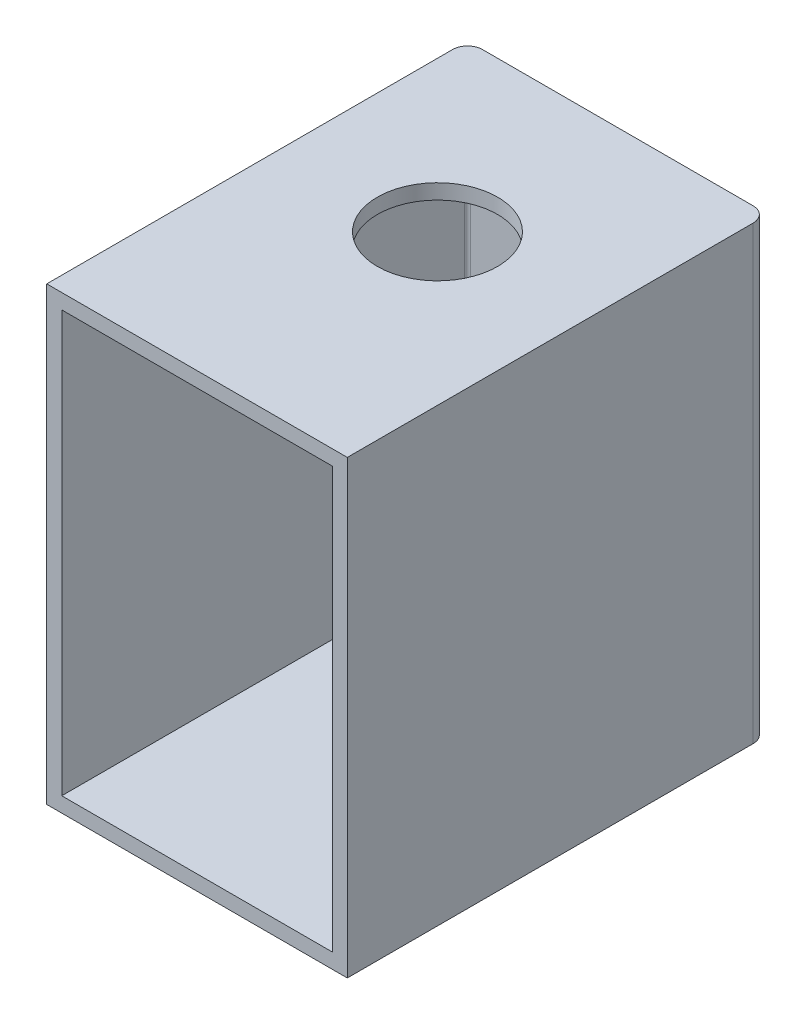
ISO-10303-21;
HEADER;
FILE_DESCRIPTION(('STEP AP214'),'2;1');
FILE_NAME('part.step','',(''),(''),'','','');
FILE_SCHEMA(('AUTOMOTIVE_DESIGN { 1 0 10303 214 1 1 1 1 }'));
ENDSEC;
DATA;
#1=APPLICATION_CONTEXT('core data for automotive mechanical design processes');
#2=APPLICATION_PROTOCOL_DEFINITION('international standard','automotive_design',2000,#1);
#3=PRODUCT_CONTEXT('',#1,'mechanical');
#4=PRODUCT('Part','Part','',(#3));
#5=PRODUCT_RELATED_PRODUCT_CATEGORY('part','',(#4));
#6=PRODUCT_DEFINITION_FORMATION('','',#4);
#7=PRODUCT_DEFINITION_CONTEXT('part definition',#1,'design');
#8=PRODUCT_DEFINITION('design','',#6,#7);
#9=PRODUCT_DEFINITION_SHAPE('','',#8);
#10=(LENGTH_UNIT() NAMED_UNIT(*) SI_UNIT(.MILLI.,.METRE.));
#11=(NAMED_UNIT(*) PLANE_ANGLE_UNIT() SI_UNIT($,.RADIAN.));
#12=(NAMED_UNIT(*) SI_UNIT($,.STERADIAN.) SOLID_ANGLE_UNIT());
#13=UNCERTAINTY_MEASURE_WITH_UNIT(LENGTH_MEASURE(1.E-05),#10,'distance_accuracy_value','');
#14=(GEOMETRIC_REPRESENTATION_CONTEXT(3) GLOBAL_UNCERTAINTY_ASSIGNED_CONTEXT((#13)) GLOBAL_UNIT_ASSIGNED_CONTEXT((#10,
#11,#12)) REPRESENTATION_CONTEXT('',''));
#15=CARTESIAN_POINT('',(0.,0.,0.));
#16=DIRECTION('',(0.,0.,1.));
#17=DIRECTION('',(1.,0.,0.));
#18=AXIS2_PLACEMENT_3D('',#15,#16,#17);
#19=CARTESIAN_POINT('',(-10.,15.,14.));
#20=DIRECTION('',(0.,0.,-1.));
#21=DIRECTION('',(-1.,0.,0.));
#22=AXIS2_PLACEMENT_3D('',#19,#20,#21);
#23=PLANE('',#22);
#24=DIRECTION('',(1.,0.,0.));
#25=VECTOR('',#24,1.);
#26=CARTESIAN_POINT('',(-10.,-15.,14.));
#27=LINE('',#26,#25);
#28=CARTESIAN_POINT('',(-10.,-15.,14.));
#29=VERTEX_POINT('',#28);
#30=CARTESIAN_POINT('',(10.,-15.,14.));
#31=VERTEX_POINT('',#30);
#32=EDGE_CURVE('E157',#29,#31,#27,.T.);
#33=ORIENTED_EDGE('',*,*,#32,.T.);
#34=DIRECTION('',(0.,-1.,0.));
#35=VECTOR('',#34,1.);
#36=CARTESIAN_POINT('',(10.,15.,14.));
#37=LINE('',#36,#35);
#38=CARTESIAN_POINT('',(10.,15.,14.));
#39=VERTEX_POINT('',#38);
#40=EDGE_CURVE('E164',#39,#31,#37,.T.);
#41=ORIENTED_EDGE('',*,*,#40,.F.);
#42=DIRECTION('',(1.,0.,0.));
#43=VECTOR('',#42,1.);
#44=CARTESIAN_POINT('',(-10.,15.,14.));
#45=LINE('',#44,#43);
#46=CARTESIAN_POINT('',(-10.,15.,14.));
#47=VERTEX_POINT('',#46);
#48=EDGE_CURVE('E162',#47,#39,#45,.T.);
#49=ORIENTED_EDGE('',*,*,#48,.F.);
#50=DIRECTION('',(0.,-1.,0.));
#51=VECTOR('',#50,1.);
#52=CARTESIAN_POINT('',(-10.,15.,14.));
#53=LINE('',#52,#51);
#54=EDGE_CURVE('E175',#47,#29,#53,.T.);
#55=ORIENTED_EDGE('',*,*,#54,.T.);
#56=EDGE_LOOP('',(#33,#41,#49,#55));
#57=FACE_BOUND('',#56,.T.);
#58=DIRECTION('',(1.,0.,0.));
#59=VECTOR('',#58,1.);
#60=CARTESIAN_POINT('',(-10.,-14.,14.));
#61=LINE('',#60,#59);
#62=CARTESIAN_POINT('',(-9.,-14.,14.));
#63=VERTEX_POINT('',#62);
#64=CARTESIAN_POINT('',(9.,-14.,14.));
#65=VERTEX_POINT('',#64);
#66=EDGE_CURVE('E141',#63,#65,#61,.T.);
#67=ORIENTED_EDGE('',*,*,#66,.F.);
#68=DIRECTION('',(0.,-1.,0.));
#69=VECTOR('',#68,1.);
#70=CARTESIAN_POINT('',(-9.,15.,14.));
#71=LINE('',#70,#69);
#72=CARTESIAN_POINT('',(-9.,14.,14.));
#73=VERTEX_POINT('',#72);
#74=EDGE_CURVE('E130',#73,#63,#71,.T.);
#75=ORIENTED_EDGE('',*,*,#74,.F.);
#76=DIRECTION('',(1.,0.,0.));
#77=VECTOR('',#76,1.);
#78=CARTESIAN_POINT('',(-10.,14.,14.));
#79=LINE('',#78,#77);
#80=CARTESIAN_POINT('',(9.,14.,14.));
#81=VERTEX_POINT('',#80);
#82=EDGE_CURVE('E131',#73,#81,#79,.T.);
#83=ORIENTED_EDGE('',*,*,#82,.T.);
#84=DIRECTION('',(0.,-1.,0.));
#85=VECTOR('',#84,1.);
#86=CARTESIAN_POINT('',(9.,15.,14.));
#87=LINE('',#86,#85);
#88=EDGE_CURVE('E122',#81,#65,#87,.T.);
#89=ORIENTED_EDGE('',*,*,#88,.T.);
#90=EDGE_LOOP('',(#67,#75,#83,#89));
#91=FACE_BOUND('',#90,.T.);
#92=ADVANCED_FACE('F32',(#57,#91),#23,.F.);
#93=CARTESIAN_POINT('',(10.,15.,-14.));
#94=DIRECTION('',(-1.,0.,0.));
#95=DIRECTION('',(0.,0.,1.));
#96=AXIS2_PLACEMENT_3D('',#93,#94,#95);
#97=PLANE('',#96);
#98=DIRECTION('',(0.,0.,-1.));
#99=VECTOR('',#98,1.);
#100=CARTESIAN_POINT('',(10.,-15.,-14.));
#101=LINE('',#100,#99);
#102=CARTESIAN_POINT('',(10.,-15.,-13.));
#103=VERTEX_POINT('',#102);
#104=EDGE_CURVE('E150',#31,#103,#101,.T.);
#105=ORIENTED_EDGE('',*,*,#104,.T.);
#106=DIRECTION('',(0.,-1.,0.));
#107=VECTOR('',#106,1.);
#108=CARTESIAN_POINT('',(10.,15.,-13.));
#109=LINE('',#108,#107);
#110=CARTESIAN_POINT('',(10.,15.,-13.));
#111=VERTEX_POINT('',#110);
#112=EDGE_CURVE('E194',#103,#111,#109,.F.);
#113=ORIENTED_EDGE('',*,*,#112,.T.);
#114=DIRECTION('',(0.,0.,-1.));
#115=VECTOR('',#114,1.);
#116=CARTESIAN_POINT('',(10.,15.,-14.));
#117=LINE('',#116,#115);
#118=EDGE_CURVE('E153',#39,#111,#117,.T.);
#119=ORIENTED_EDGE('',*,*,#118,.F.);
#120=ORIENTED_EDGE('',*,*,#40,.T.);
#121=EDGE_LOOP('',(#105,#113,#119,#120));
#122=FACE_BOUND('',#121,.T.);
#123=ADVANCED_FACE('F229',(#122),#97,.F.);
#124=CARTESIAN_POINT('',(-10.,15.,-14.));
#125=DIRECTION('',(0.,0.,1.));
#126=DIRECTION('',(1.,0.,0.));
#127=AXIS2_PLACEMENT_3D('',#124,#125,#126);
#128=PLANE('',#127);
#129=DIRECTION('',(-1.,0.,0.));
#130=VECTOR('',#129,1.);
#131=CARTESIAN_POINT('',(-10.,-15.,-14.));
#132=LINE('',#131,#130);
#133=CARTESIAN_POINT('',(9.,-15.,-14.));
#134=VERTEX_POINT('',#133);
#135=CARTESIAN_POINT('',(-9.,-15.,-14.));
#136=VERTEX_POINT('',#135);
#137=EDGE_CURVE('E167',#134,#136,#132,.T.);
#138=ORIENTED_EDGE('',*,*,#137,.T.);
#139=DIRECTION('',(0.,-1.,0.));
#140=VECTOR('',#139,1.);
#141=CARTESIAN_POINT('',(-9.,15.,-14.));
#142=LINE('',#141,#140);
#143=CARTESIAN_POINT('',(-9.,15.,-14.));
#144=VERTEX_POINT('',#143);
#145=EDGE_CURVE('E188',#136,#144,#142,.F.);
#146=ORIENTED_EDGE('',*,*,#145,.T.);
#147=DIRECTION('',(-1.,0.,0.));
#148=VECTOR('',#147,1.);
#149=CARTESIAN_POINT('',(-10.,15.,-14.));
#150=LINE('',#149,#148);
#151=CARTESIAN_POINT('',(9.,15.,-14.));
#152=VERTEX_POINT('',#151);
#153=EDGE_CURVE('E156',#152,#144,#150,.T.);
#154=ORIENTED_EDGE('',*,*,#153,.F.);
#155=DIRECTION('',(0.,-1.,0.));
#156=VECTOR('',#155,1.);
#157=CARTESIAN_POINT('',(9.,15.,-14.));
#158=LINE('',#157,#156);
#159=EDGE_CURVE('E185',#152,#134,#158,.T.);
#160=ORIENTED_EDGE('',*,*,#159,.T.);
#161=EDGE_LOOP('',(#138,#146,#154,#160));
#162=FACE_BOUND('',#161,.T.);
#163=ADVANCED_FACE('F235',(#162),#128,.F.);
#164=CARTESIAN_POINT('',(-10.,15.,-14.));
#165=DIRECTION('',(1.,0.,0.));
#166=DIRECTION('',(0.,0.,-1.));
#167=AXIS2_PLACEMENT_3D('',#164,#165,#166);
#168=PLANE('',#167);
#169=DIRECTION('',(0.,0.,1.));
#170=VECTOR('',#169,1.);
#171=CARTESIAN_POINT('',(-10.,15.,-14.));
#172=LINE('',#171,#170);
#173=CARTESIAN_POINT('',(-10.,15.,-13.));
#174=VERTEX_POINT('',#173);
#175=EDGE_CURVE('E160',#174,#47,#172,.T.);
#176=ORIENTED_EDGE('',*,*,#175,.F.);
#177=DIRECTION('',(0.,-1.,0.));
#178=VECTOR('',#177,1.);
#179=CARTESIAN_POINT('',(-10.,15.,-13.));
#180=LINE('',#179,#178);
#181=CARTESIAN_POINT('',(-10.,-15.,-13.));
#182=VERTEX_POINT('',#181);
#183=EDGE_CURVE('E178',#174,#182,#180,.T.);
#184=ORIENTED_EDGE('',*,*,#183,.T.);
#185=DIRECTION('',(0.,0.,1.));
#186=VECTOR('',#185,1.);
#187=CARTESIAN_POINT('',(-10.,-15.,-14.));
#188=LINE('',#187,#186);
#189=EDGE_CURVE('E170',#182,#29,#188,.T.);
#190=ORIENTED_EDGE('',*,*,#189,.T.);
#191=ORIENTED_EDGE('',*,*,#54,.F.);
#192=EDGE_LOOP('',(#176,#184,#190,#191));
#193=FACE_BOUND('',#192,.T.);
#194=ADVANCED_FACE('F242',(#193),#168,.F.);
#195=CARTESIAN_POINT('',(0.,15.,0.));
#196=DIRECTION('',(0.,1.,0.));
#197=DIRECTION('',(0.,0.,1.));
#198=AXIS2_PLACEMENT_3D('',#195,#196,#197);
#199=PLANE('',#198);
#200=CARTESIAN_POINT('',(0.,15.,-2.));
#201=DIRECTION('',(0.,1.,0.));
#202=DIRECTION('',(0.,0.,1.));
#203=AXIS2_PLACEMENT_3D('',#200,#201,#202);
#204=CIRCLE('',#203,4.);
#205=CARTESIAN_POINT('',(0.,15.,2.));
#206=VERTEX_POINT('',#205);
#207=EDGE_CURVE('E287',#206,#206,#204,.T.);
#208=ORIENTED_EDGE('',*,*,#207,.F.);
#209=EDGE_LOOP('',(#208));
#210=FACE_BOUND('',#209,.T.);
#211=ORIENTED_EDGE('',*,*,#153,.T.);
#212=CARTESIAN_POINT('',(-9.,15.,-13.));
#213=DIRECTION('',(0.,1.,0.));
#214=DIRECTION('',(0.,0.,1.));
#215=AXIS2_PLACEMENT_3D('',#212,#213,#214);
#216=CIRCLE('',#215,1.);
#217=EDGE_CURVE('E192',#144,#174,#216,.T.);
#218=ORIENTED_EDGE('',*,*,#217,.T.);
#219=ORIENTED_EDGE('',*,*,#175,.T.);
#220=ORIENTED_EDGE('',*,*,#48,.T.);
#221=ORIENTED_EDGE('',*,*,#118,.T.);
#222=CARTESIAN_POINT('',(9.,15.,-13.));
#223=DIRECTION('',(0.,1.,0.));
#224=DIRECTION('',(0.,0.,1.));
#225=AXIS2_PLACEMENT_3D('',#222,#223,#224);
#226=CIRCLE('',#225,1.);
#227=EDGE_CURVE('E190',#111,#152,#226,.T.);
#228=ORIENTED_EDGE('',*,*,#227,.T.);
#229=EDGE_LOOP('',(#211,#218,#219,#220,#221,#228));
#230=FACE_BOUND('',#229,.T.);
#231=ADVANCED_FACE('F245',(#210,#230),#199,.T.);
#232=CARTESIAN_POINT('',(0.,-15.,0.));
#233=DIRECTION('',(0.,1.,0.));
#234=DIRECTION('',(0.,0.,1.));
#235=AXIS2_PLACEMENT_3D('',#232,#233,#234);
#236=PLANE('',#235);
#237=CARTESIAN_POINT('',(0.,-15.,-2.));
#238=DIRECTION('',(0.,1.,0.));
#239=DIRECTION('',(0.,0.,1.));
#240=AXIS2_PLACEMENT_3D('',#237,#238,#239);
#241=CIRCLE('',#240,4.5);
#242=CARTESIAN_POINT('',(0.,-15.,2.5));
#243=VERTEX_POINT('',#242);
#244=EDGE_CURVE('E286',#243,#243,#241,.T.);
#245=ORIENTED_EDGE('',*,*,#244,.T.);
#246=EDGE_LOOP('',(#245));
#247=FACE_BOUND('',#246,.T.);
#248=ORIENTED_EDGE('',*,*,#189,.F.);
#249=CARTESIAN_POINT('',(-9.,-15.,-13.));
#250=DIRECTION('',(0.,1.,0.));
#251=DIRECTION('',(0.,0.,1.));
#252=AXIS2_PLACEMENT_3D('',#249,#250,#251);
#253=CIRCLE('',#252,1.);
#254=EDGE_CURVE('E183',#182,#136,#253,.F.);
#255=ORIENTED_EDGE('',*,*,#254,.T.);
#256=ORIENTED_EDGE('',*,*,#137,.F.);
#257=CARTESIAN_POINT('',(9.,-15.,-13.));
#258=DIRECTION('',(0.,1.,0.));
#259=DIRECTION('',(0.,0.,1.));
#260=AXIS2_PLACEMENT_3D('',#257,#258,#259);
#261=CIRCLE('',#260,1.);
#262=EDGE_CURVE('E181',#134,#103,#261,.F.);
#263=ORIENTED_EDGE('',*,*,#262,.T.);
#264=ORIENTED_EDGE('',*,*,#104,.F.);
#265=ORIENTED_EDGE('',*,*,#32,.F.);
#266=EDGE_LOOP('',(#248,#255,#256,#263,#264,#265));
#267=FACE_BOUND('',#266,.T.);
#268=ADVANCED_FACE('F240',(#247,#267),#236,.F.);
#269=CARTESIAN_POINT('',(-9.,15.,-13.));
#270=DIRECTION('',(0.,-1.,0.));
#271=DIRECTION('',(0.,0.,-1.));
#272=AXIS2_PLACEMENT_3D('',#269,#270,#271);
#273=CYLINDRICAL_SURFACE('',#272,1.);
#274=ORIENTED_EDGE('',*,*,#217,.F.);
#275=ORIENTED_EDGE('',*,*,#145,.F.);
#276=ORIENTED_EDGE('',*,*,#254,.F.);
#277=ORIENTED_EDGE('',*,*,#183,.F.);
#278=EDGE_LOOP('',(#274,#275,#276,#277));
#279=FACE_BOUND('',#278,.T.);
#280=ADVANCED_FACE('F250',(#279),#273,.T.);
#281=CARTESIAN_POINT('',(9.,15.,-13.));
#282=DIRECTION('',(0.,-1.,0.));
#283=DIRECTION('',(0.,0.,-1.));
#284=AXIS2_PLACEMENT_3D('',#281,#282,#283);
#285=CYLINDRICAL_SURFACE('',#284,1.);
#286=ORIENTED_EDGE('',*,*,#227,.F.);
#287=ORIENTED_EDGE('',*,*,#112,.F.);
#288=ORIENTED_EDGE('',*,*,#262,.F.);
#289=ORIENTED_EDGE('',*,*,#159,.F.);
#290=EDGE_LOOP('',(#286,#287,#288,#289));
#291=FACE_BOUND('',#290,.T.);
#292=ADVANCED_FACE('F252',(#291),#285,.T.);
#293=CARTESIAN_POINT('',(9.,15.,-14.));
#294=DIRECTION('',(-1.,0.,0.));
#295=DIRECTION('',(0.,0.,1.));
#296=AXIS2_PLACEMENT_3D('',#293,#294,#295);
#297=PLANE('',#296);
#298=DIRECTION('',(0.,0.,-1.));
#299=VECTOR('',#298,1.);
#300=CARTESIAN_POINT('',(9.,14.,-14.));
#301=LINE('',#300,#299);
#302=CARTESIAN_POINT('',(9.,14.,-12.8));
#303=VERTEX_POINT('',#302);
#304=EDGE_CURVE('E125',#81,#303,#301,.T.);
#305=ORIENTED_EDGE('',*,*,#304,.T.);
#306=DIRECTION('',(0.,1.,0.));
#307=VECTOR('',#306,1.);
#308=CARTESIAN_POINT('',(9.,-14.,-12.8));
#309=LINE('',#308,#307);
#310=CARTESIAN_POINT('',(9.,-14.,-12.8));
#311=VERTEX_POINT('',#310);
#312=EDGE_CURVE('E55',#303,#311,#309,.F.);
#313=ORIENTED_EDGE('',*,*,#312,.T.);
#314=DIRECTION('',(0.,0.,-1.));
#315=VECTOR('',#314,1.);
#316=CARTESIAN_POINT('',(9.,-14.,-14.));
#317=LINE('',#316,#315);
#318=EDGE_CURVE('E126',#65,#311,#317,.T.);
#319=ORIENTED_EDGE('',*,*,#318,.F.);
#320=ORIENTED_EDGE('',*,*,#88,.F.);
#321=EDGE_LOOP('',(#305,#313,#319,#320));
#322=FACE_BOUND('',#321,.T.);
#323=ADVANCED_FACE('F124',(#322),#297,.T.);
#324=CARTESIAN_POINT('',(-10.,15.,-13.));
#325=DIRECTION('',(0.,0.,1.));
#326=DIRECTION('',(1.,0.,0.));
#327=AXIS2_PLACEMENT_3D('',#324,#325,#326);
#328=PLANE('',#327);
#329=DIRECTION('',(-1.,0.,0.));
#330=VECTOR('',#329,1.);
#331=CARTESIAN_POINT('',(-10.,-14.,-13.));
#332=LINE('',#331,#330);
#333=CARTESIAN_POINT('',(8.8,-14.,-13.));
#334=VERTEX_POINT('',#333);
#335=CARTESIAN_POINT('',(-8.8,-14.,-13.));
#336=VERTEX_POINT('',#335);
#337=EDGE_CURVE('E208',#334,#336,#332,.T.);
#338=ORIENTED_EDGE('',*,*,#337,.F.);
#339=DIRECTION('',(0.,1.,0.));
#340=VECTOR('',#339,1.);
#341=CARTESIAN_POINT('',(8.8,14.,-13.));
#342=LINE('',#341,#340);
#343=CARTESIAN_POINT('',(8.8,14.,-13.));
#344=VERTEX_POINT('',#343);
#345=EDGE_CURVE('E198',#334,#344,#342,.T.);
#346=ORIENTED_EDGE('',*,*,#345,.T.);
#347=DIRECTION('',(-1.,0.,0.));
#348=VECTOR('',#347,1.);
#349=CARTESIAN_POINT('',(-10.,14.,-13.));
#350=LINE('',#349,#348);
#351=CARTESIAN_POINT('',(-8.8,14.,-13.));
#352=VERTEX_POINT('',#351);
#353=EDGE_CURVE('E140',#344,#352,#350,.T.);
#354=ORIENTED_EDGE('',*,*,#353,.T.);
#355=DIRECTION('',(0.,1.,0.));
#356=VECTOR('',#355,1.);
#357=CARTESIAN_POINT('',(-8.8,-14.,-13.));
#358=LINE('',#357,#356);
#359=EDGE_CURVE('E196',#352,#336,#358,.F.);
#360=ORIENTED_EDGE('',*,*,#359,.T.);
#361=EDGE_LOOP('',(#338,#346,#354,#360));
#362=FACE_BOUND('',#361,.T.);
#363=ADVANCED_FACE('F212',(#362),#328,.T.);
#364=CARTESIAN_POINT('',(-9.,15.,-14.));
#365=DIRECTION('',(1.,0.,0.));
#366=DIRECTION('',(0.,0.,-1.));
#367=AXIS2_PLACEMENT_3D('',#364,#365,#366);
#368=PLANE('',#367);
#369=DIRECTION('',(0.,0.,1.));
#370=VECTOR('',#369,1.);
#371=CARTESIAN_POINT('',(-9.,-14.,-14.));
#372=LINE('',#371,#370);
#373=CARTESIAN_POINT('',(-9.,-14.,-12.8));
#374=VERTEX_POINT('',#373);
#375=EDGE_CURVE('E152',#374,#63,#372,.T.);
#376=ORIENTED_EDGE('',*,*,#375,.F.);
#377=DIRECTION('',(0.,1.,0.));
#378=VECTOR('',#377,1.);
#379=CARTESIAN_POINT('',(-9.,14.,-12.8));
#380=LINE('',#379,#378);
#381=CARTESIAN_POINT('',(-9.,14.,-12.8));
#382=VERTEX_POINT('',#381);
#383=EDGE_CURVE('E11',#374,#382,#380,.T.);
#384=ORIENTED_EDGE('',*,*,#383,.T.);
#385=DIRECTION('',(0.,0.,1.));
#386=VECTOR('',#385,1.);
#387=CARTESIAN_POINT('',(-9.,14.,-14.));
#388=LINE('',#387,#386);
#389=EDGE_CURVE('E144',#382,#73,#388,.T.);
#390=ORIENTED_EDGE('',*,*,#389,.T.);
#391=ORIENTED_EDGE('',*,*,#74,.T.);
#392=EDGE_LOOP('',(#376,#384,#390,#391));
#393=FACE_BOUND('',#392,.T.);
#394=ADVANCED_FACE('F301',(#393),#368,.T.);
#395=CARTESIAN_POINT('',(0.,14.,0.));
#396=DIRECTION('',(0.,1.,0.));
#397=DIRECTION('',(0.,0.,1.));
#398=AXIS2_PLACEMENT_3D('',#395,#396,#397);
#399=PLANE('',#398);
#400=CARTESIAN_POINT('',(0.,14.,-2.));
#401=DIRECTION('',(0.,1.,0.));
#402=DIRECTION('',(0.,0.,1.));
#403=AXIS2_PLACEMENT_3D('',#400,#401,#402);
#404=CIRCLE('',#403,4.);
#405=CARTESIAN_POINT('',(0.,14.,2.));
#406=VERTEX_POINT('',#405);
#407=EDGE_CURVE('E291',#406,#406,#404,.F.);
#408=ORIENTED_EDGE('',*,*,#407,.F.);
#409=EDGE_LOOP('',(#408));
#410=FACE_BOUND('',#409,.T.);
#411=ORIENTED_EDGE('',*,*,#353,.F.);
#412=CARTESIAN_POINT('',(8.8,14.,-12.8));
#413=DIRECTION('',(0.,1.,0.));
#414=DIRECTION('',(0.,0.,1.));
#415=AXIS2_PLACEMENT_3D('',#412,#413,#414);
#416=CIRCLE('',#415,0.2);
#417=EDGE_CURVE('E139',#344,#303,#416,.F.);
#418=ORIENTED_EDGE('',*,*,#417,.T.);
#419=ORIENTED_EDGE('',*,*,#304,.F.);
#420=ORIENTED_EDGE('',*,*,#82,.F.);
#421=ORIENTED_EDGE('',*,*,#389,.F.);
#422=CARTESIAN_POINT('',(-8.8,14.,-12.8));
#423=DIRECTION('',(0.,1.,0.));
#424=DIRECTION('',(0.,0.,1.));
#425=AXIS2_PLACEMENT_3D('',#422,#423,#424);
#426=CIRCLE('',#425,0.2);
#427=EDGE_CURVE('E201',#382,#352,#426,.F.);
#428=ORIENTED_EDGE('',*,*,#427,.T.);
#429=EDGE_LOOP('',(#411,#418,#419,#420,#421,#428));
#430=FACE_BOUND('',#429,.T.);
#431=ADVANCED_FACE('F136',(#410,#430),#399,.F.);
#432=CARTESIAN_POINT('',(0.,-14.,0.));
#433=DIRECTION('',(0.,1.,0.));
#434=DIRECTION('',(0.,0.,1.));
#435=AXIS2_PLACEMENT_3D('',#432,#433,#434);
#436=PLANE('',#435);
#437=CARTESIAN_POINT('',(0.,-14.,-2.));
#438=DIRECTION('',(0.,1.,0.));
#439=DIRECTION('',(0.,0.,1.));
#440=AXIS2_PLACEMENT_3D('',#437,#438,#439);
#441=CIRCLE('',#440,4.5);
#442=CARTESIAN_POINT('',(0.,-14.,2.5));
#443=VERTEX_POINT('',#442);
#444=EDGE_CURVE('E288',#443,#443,#441,.T.);
#445=ORIENTED_EDGE('',*,*,#444,.F.);
#446=EDGE_LOOP('',(#445));
#447=FACE_BOUND('',#446,.T.);
#448=ORIENTED_EDGE('',*,*,#318,.T.);
#449=CARTESIAN_POINT('',(8.8,-14.,-12.8));
#450=DIRECTION('',(0.,1.,0.));
#451=DIRECTION('',(0.,0.,1.));
#452=AXIS2_PLACEMENT_3D('',#449,#450,#451);
#453=CIRCLE('',#452,0.2);
#454=EDGE_CURVE('E40',#311,#334,#453,.T.);
#455=ORIENTED_EDGE('',*,*,#454,.T.);
#456=ORIENTED_EDGE('',*,*,#337,.T.);
#457=CARTESIAN_POINT('',(-8.8,-14.,-12.8));
#458=DIRECTION('',(0.,1.,0.));
#459=DIRECTION('',(0.,0.,1.));
#460=AXIS2_PLACEMENT_3D('',#457,#458,#459);
#461=CIRCLE('',#460,0.2);
#462=EDGE_CURVE('E47',#336,#374,#461,.T.);
#463=ORIENTED_EDGE('',*,*,#462,.T.);
#464=ORIENTED_EDGE('',*,*,#375,.T.);
#465=ORIENTED_EDGE('',*,*,#66,.T.);
#466=EDGE_LOOP('',(#448,#455,#456,#463,#464,#465));
#467=FACE_BOUND('',#466,.T.);
#468=ADVANCED_FACE('F207',(#447,#467),#436,.T.);
#469=CARTESIAN_POINT('',(0.,-15.001,-2.));
#470=DIRECTION('',(0.,1.,0.));
#471=DIRECTION('',(0.,0.,1.));
#472=AXIS2_PLACEMENT_3D('',#469,#470,#471);
#473=CYLINDRICAL_SURFACE('',#472,4.);
#474=ORIENTED_EDGE('',*,*,#207,.T.);
#475=EDGE_LOOP('',(#474));
#476=FACE_BOUND('',#475,.T.);
#477=ORIENTED_EDGE('',*,*,#407,.T.);
#478=EDGE_LOOP('',(#477));
#479=FACE_BOUND('',#478,.T.);
#480=ADVANCED_FACE('F224',(#476,#479),#473,.F.);
#481=CARTESIAN_POINT('',(0.,-15.,-2.));
#482=DIRECTION('',(0.,1.,0.));
#483=DIRECTION('',(0.,0.,1.));
#484=AXIS2_PLACEMENT_3D('',#481,#482,#483);
#485=CYLINDRICAL_SURFACE('',#484,4.5);
#486=ORIENTED_EDGE('',*,*,#244,.F.);
#487=EDGE_LOOP('',(#486));
#488=FACE_BOUND('',#487,.T.);
#489=ORIENTED_EDGE('',*,*,#444,.T.);
#490=EDGE_LOOP('',(#489));
#491=FACE_BOUND('',#490,.T.);
#492=ADVANCED_FACE('F218',(#488,#491),#485,.F.);
#493=CARTESIAN_POINT('',(8.8,15.,-12.8));
#494=DIRECTION('',(0.,-1.,0.));
#495=DIRECTION('',(0.,0.,-1.));
#496=AXIS2_PLACEMENT_3D('',#493,#494,#495);
#497=CYLINDRICAL_SURFACE('',#496,0.2);
#498=ORIENTED_EDGE('',*,*,#454,.F.);
#499=ORIENTED_EDGE('',*,*,#312,.F.);
#500=ORIENTED_EDGE('',*,*,#417,.F.);
#501=ORIENTED_EDGE('',*,*,#345,.F.);
#502=EDGE_LOOP('',(#498,#499,#500,#501));
#503=FACE_BOUND('',#502,.T.);
#504=ADVANCED_FACE('F216',(#503),#497,.F.);
#505=CARTESIAN_POINT('',(-8.8,15.,-12.8));
#506=DIRECTION('',(0.,-1.,0.));
#507=DIRECTION('',(0.,0.,-1.));
#508=AXIS2_PLACEMENT_3D('',#505,#506,#507);
#509=CYLINDRICAL_SURFACE('',#508,0.2);
#510=ORIENTED_EDGE('',*,*,#462,.F.);
#511=ORIENTED_EDGE('',*,*,#359,.F.);
#512=ORIENTED_EDGE('',*,*,#427,.F.);
#513=ORIENTED_EDGE('',*,*,#383,.F.);
#514=EDGE_LOOP('',(#510,#511,#512,#513));
#515=FACE_BOUND('',#514,.T.);
#516=ADVANCED_FACE('F34',(#515),#509,.F.);
#517=CLOSED_SHELL('',(#92,#123,#163,#194,#231,#268,#280,#292,#323,#363,#394,#431,#468,#480,#492,
#504,#516));
#518=MANIFOLD_SOLID_BREP('B2',#517);
#519=ADVANCED_BREP_SHAPE_REPRESENTATION('',(#18,#518),#14);
#520=SHAPE_DEFINITION_REPRESENTATION(#9,#519);
ENDSEC;
END-ISO-10303-21;
